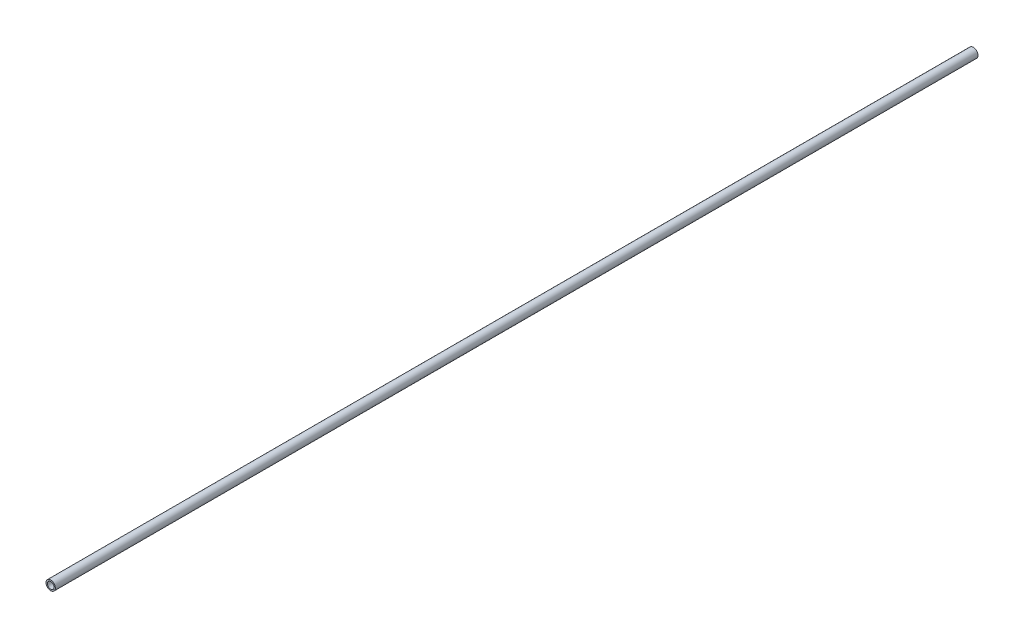
ISO-10303-21;
HEADER;
FILE_DESCRIPTION(('STEP AP214'),'2;1');
FILE_NAME('part.step','',(''),(''),'','','');
FILE_SCHEMA(('AUTOMOTIVE_DESIGN { 1 0 10303 214 1 1 1 1 }'));
ENDSEC;
DATA;
#1=APPLICATION_CONTEXT('core data for automotive mechanical design processes');
#2=APPLICATION_PROTOCOL_DEFINITION('international standard','automotive_design',2000,#1);
#3=PRODUCT_CONTEXT('',#1,'mechanical');
#4=PRODUCT('Part','Part','',(#3));
#5=PRODUCT_RELATED_PRODUCT_CATEGORY('part','',(#4));
#6=PRODUCT_DEFINITION_FORMATION('','',#4);
#7=PRODUCT_DEFINITION_CONTEXT('part definition',#1,'design');
#8=PRODUCT_DEFINITION('design','',#6,#7);
#9=PRODUCT_DEFINITION_SHAPE('','',#8);
#10=(LENGTH_UNIT() NAMED_UNIT(*) SI_UNIT(.MILLI.,.METRE.));
#11=(NAMED_UNIT(*) PLANE_ANGLE_UNIT() SI_UNIT($,.RADIAN.));
#12=(NAMED_UNIT(*) SI_UNIT($,.STERADIAN.) SOLID_ANGLE_UNIT());
#13=UNCERTAINTY_MEASURE_WITH_UNIT(LENGTH_MEASURE(1.E-05),#10,'distance_accuracy_value','');
#14=(GEOMETRIC_REPRESENTATION_CONTEXT(3) GLOBAL_UNCERTAINTY_ASSIGNED_CONTEXT((#13)) GLOBAL_UNIT_ASSIGNED_CONTEXT((#10,
#11,#12)) REPRESENTATION_CONTEXT('',''));
#15=CARTESIAN_POINT('',(0.,0.,0.));
#16=DIRECTION('',(0.,0.,1.));
#17=DIRECTION('',(1.,0.,0.));
#18=AXIS2_PLACEMENT_3D('',#15,#16,#17);
#19=CARTESIAN_POINT('',(0.,0.,-345.));
#20=DIRECTION('',(0.,0.,1.));
#21=DIRECTION('',(1.,0.,0.));
#22=AXIS2_PLACEMENT_3D('',#19,#20,#21);
#23=CYLINDRICAL_SURFACE('',#22,1.75);
#24=CARTESIAN_POINT('',(0.,0.,-345.));
#25=DIRECTION('',(0.,0.,1.));
#26=DIRECTION('',(1.,0.,0.));
#27=AXIS2_PLACEMENT_3D('',#24,#25,#26);
#28=CIRCLE('',#27,1.75);
#29=CARTESIAN_POINT('',(1.75,0.,-345.));
#30=VERTEX_POINT('',#29);
#31=EDGE_CURVE('E10',#30,#30,#28,.T.);
#32=ORIENTED_EDGE('',*,*,#31,.T.);
#33=EDGE_LOOP('',(#32));
#34=FACE_BOUND('',#33,.T.);
#35=CARTESIAN_POINT('',(0.,0.,0.));
#36=DIRECTION('',(0.,0.,1.));
#37=DIRECTION('',(1.,0.,0.));
#38=AXIS2_PLACEMENT_3D('',#35,#36,#37);
#39=CIRCLE('',#38,1.75);
#40=CARTESIAN_POINT('',(1.75,0.,0.));
#41=VERTEX_POINT('',#40);
#42=EDGE_CURVE('E42',#41,#41,#39,.T.);
#43=ORIENTED_EDGE('',*,*,#42,.F.);
#44=EDGE_LOOP('',(#43));
#45=FACE_BOUND('',#44,.T.);
#46=ADVANCED_FACE('F39',(#34,#45),#23,.T.);
#47=CARTESIAN_POINT('',(0.,0.,-345.));
#48=DIRECTION('',(0.,0.,1.));
#49=DIRECTION('',(1.,0.,0.));
#50=AXIS2_PLACEMENT_3D('',#47,#48,#49);
#51=PLANE('',#50);
#52=CARTESIAN_POINT('',(0.,0.,-345.));
#53=DIRECTION('',(0.,0.,1.));
#54=DIRECTION('',(1.,0.,0.));
#55=AXIS2_PLACEMENT_3D('',#52,#53,#54);
#56=CIRCLE('',#55,1.25);
#57=CARTESIAN_POINT('',(1.25,0.,-345.));
#58=VERTEX_POINT('',#57);
#59=EDGE_CURVE('E51',#58,#58,#56,.T.);
#60=ORIENTED_EDGE('',*,*,#59,.T.);
#61=EDGE_LOOP('',(#60));
#62=FACE_BOUND('',#61,.T.);
#63=ORIENTED_EDGE('',*,*,#31,.F.);
#64=EDGE_LOOP('',(#63));
#65=FACE_BOUND('',#64,.T.);
#66=ADVANCED_FACE('F61',(#62,#65),#51,.F.);
#67=CARTESIAN_POINT('',(0.,0.,0.));
#68=DIRECTION('',(0.,0.,1.));
#69=DIRECTION('',(1.,0.,0.));
#70=AXIS2_PLACEMENT_3D('',#67,#68,#69);
#71=PLANE('',#70);
#72=CARTESIAN_POINT('',(0.,0.,0.));
#73=DIRECTION('',(0.,0.,1.));
#74=DIRECTION('',(1.,0.,0.));
#75=AXIS2_PLACEMENT_3D('',#72,#73,#74);
#76=CIRCLE('',#75,1.25);
#77=CARTESIAN_POINT('',(1.25,0.,0.));
#78=VERTEX_POINT('',#77);
#79=EDGE_CURVE('E53',#78,#78,#76,.T.);
#80=ORIENTED_EDGE('',*,*,#79,.F.);
#81=EDGE_LOOP('',(#80));
#82=FACE_BOUND('',#81,.T.);
#83=ORIENTED_EDGE('',*,*,#42,.T.);
#84=EDGE_LOOP('',(#83));
#85=FACE_BOUND('',#84,.T.);
#86=ADVANCED_FACE('F67',(#82,#85),#71,.T.);
#87=CARTESIAN_POINT('',(0.,0.,-345.));
#88=DIRECTION('',(0.,0.,1.));
#89=DIRECTION('',(1.,0.,0.));
#90=AXIS2_PLACEMENT_3D('',#87,#88,#89);
#91=CYLINDRICAL_SURFACE('',#90,1.25);
#92=ORIENTED_EDGE('',*,*,#59,.F.);
#93=EDGE_LOOP('',(#92));
#94=FACE_BOUND('',#93,.T.);
#95=ORIENTED_EDGE('',*,*,#79,.T.);
#96=EDGE_LOOP('',(#95));
#97=FACE_BOUND('',#96,.T.);
#98=ADVANCED_FACE('F64',(#94,#97),#91,.F.);
#99=CLOSED_SHELL('',(#46,#66,#86,#98));
#100=MANIFOLD_SOLID_BREP('B2',#99);
#101=ADVANCED_BREP_SHAPE_REPRESENTATION('',(#18,#100),#14);
#102=SHAPE_DEFINITION_REPRESENTATION(#9,#101);
ENDSEC;
END-ISO-10303-21;
